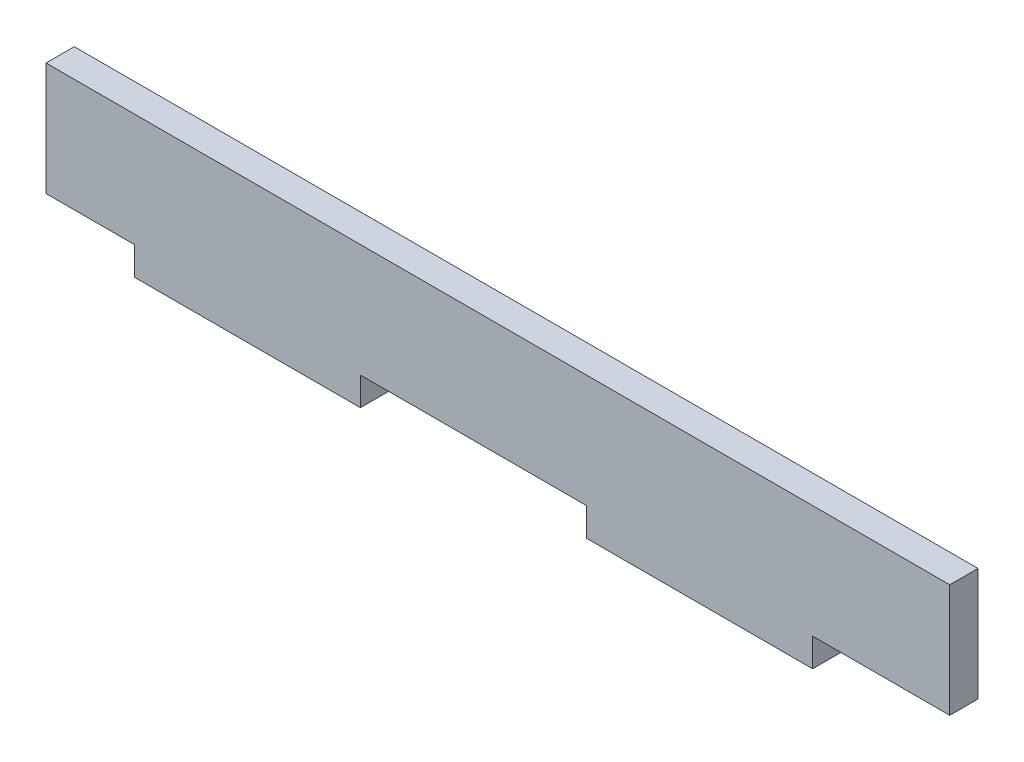
ISO-10303-21;
HEADER;
FILE_DESCRIPTION(('STEP AP214'),'2;1');
FILE_NAME('part.step','',(''),(''),'','','');
FILE_SCHEMA(('AUTOMOTIVE_DESIGN { 1 0 10303 214 1 1 1 1 }'));
ENDSEC;
DATA;
#1=APPLICATION_CONTEXT('core data for automotive mechanical design processes');
#2=APPLICATION_PROTOCOL_DEFINITION('international standard','automotive_design',2000,#1);
#3=PRODUCT_CONTEXT('',#1,'mechanical');
#4=PRODUCT('Part','Part','',(#3));
#5=PRODUCT_RELATED_PRODUCT_CATEGORY('part','',(#4));
#6=PRODUCT_DEFINITION_FORMATION('','',#4);
#7=PRODUCT_DEFINITION_CONTEXT('part definition',#1,'design');
#8=PRODUCT_DEFINITION('design','',#6,#7);
#9=PRODUCT_DEFINITION_SHAPE('','',#8);
#10=(LENGTH_UNIT() NAMED_UNIT(*) SI_UNIT(.MILLI.,.METRE.));
#11=(NAMED_UNIT(*) PLANE_ANGLE_UNIT() SI_UNIT($,.RADIAN.));
#12=(NAMED_UNIT(*) SI_UNIT($,.STERADIAN.) SOLID_ANGLE_UNIT());
#13=UNCERTAINTY_MEASURE_WITH_UNIT(LENGTH_MEASURE(1.E-05),#10,'distance_accuracy_value','');
#14=(GEOMETRIC_REPRESENTATION_CONTEXT(3) GLOBAL_UNCERTAINTY_ASSIGNED_CONTEXT((#13)) GLOBAL_UNIT_ASSIGNED_CONTEXT((#10,
#11,#12)) REPRESENTATION_CONTEXT('',''));
#15=CARTESIAN_POINT('',(0.,0.,0.));
#16=DIRECTION('',(0.,0.,1.));
#17=DIRECTION('',(1.,0.,0.));
#18=AXIS2_PLACEMENT_3D('',#15,#16,#17);
#19=CARTESIAN_POINT('',(30.9701938253052,18.6034392371989,6.35));
#20=DIRECTION('',(0.,1.,0.));
#21=DIRECTION('',(0.,0.,1.));
#22=AXIS2_PLACEMENT_3D('',#19,#20,#21);
#23=PLANE('',#22);
#24=DIRECTION('',(1.,0.,0.));
#25=VECTOR('',#24,1.);
#26=CARTESIAN_POINT('',(30.9701938253052,18.6034392371989,6.35));
#27=LINE('',#26,#25);
#28=CARTESIAN_POINT('',(50.8,18.6034392371989,6.35));
#29=VERTEX_POINT('',#28);
#30=CARTESIAN_POINT('',(101.6,18.6034392371989,6.35));
#31=VERTEX_POINT('',#30);
#32=EDGE_CURVE('E160',#29,#31,#27,.T.);
#33=ORIENTED_EDGE('',*,*,#32,.F.);
#34=DIRECTION('',(0.,0.,1.));
#35=VECTOR('',#34,1.);
#36=CARTESIAN_POINT('',(50.8,18.6034392371989,-0.00100000000000013));
#37=LINE('',#36,#35);
#38=CARTESIAN_POINT('',(50.8,18.6034392371989,0.));
#39=VERTEX_POINT('',#38);
#40=EDGE_CURVE('E212',#39,#29,#37,.T.);
#41=ORIENTED_EDGE('',*,*,#40,.F.);
#42=DIRECTION('',(1.,0.,0.));
#43=VECTOR('',#42,1.);
#44=CARTESIAN_POINT('',(30.9701938253052,18.6034392371989,0.));
#45=LINE('',#44,#43);
#46=CARTESIAN_POINT('',(101.6,18.6034392371989,0.));
#47=VERTEX_POINT('',#46);
#48=EDGE_CURVE('E147',#39,#47,#45,.T.);
#49=ORIENTED_EDGE('',*,*,#48,.T.);
#50=DIRECTION('',(0.,0.,1.));
#51=VECTOR('',#50,1.);
#52=CARTESIAN_POINT('',(101.6,18.6034392371989,-0.00100000000000013));
#53=LINE('',#52,#51);
#54=EDGE_CURVE('E189',#47,#31,#53,.T.);
#55=ORIENTED_EDGE('',*,*,#54,.T.);
#56=EDGE_LOOP('',(#33,#41,#49,#55));
#57=FACE_BOUND('',#56,.T.);
#58=ADVANCED_FACE('F33',(#57),#23,.F.);
#59=CARTESIAN_POINT('',(30.9701938253052,18.6034392371989,6.35));
#60=DIRECTION('',(1.,0.,0.));
#61=DIRECTION('',(0.,1.,0.));
#62=AXIS2_PLACEMENT_3D('',#59,#60,#61);
#63=PLANE('',#62);
#64=DIRECTION('',(0.,-1.,0.));
#65=VECTOR('',#64,1.);
#66=CARTESIAN_POINT('',(30.9701938253052,18.6034392371989,0.));
#67=LINE('',#66,#65);
#68=CARTESIAN_POINT('',(30.9701938253052,50.3534392371989,0.));
#69=VERTEX_POINT('',#68);
#70=CARTESIAN_POINT('',(30.9701938253052,24.9534392371989,0.));
#71=VERTEX_POINT('',#70);
#72=EDGE_CURVE('E132',#69,#71,#67,.T.);
#73=ORIENTED_EDGE('',*,*,#72,.T.);
#74=DIRECTION('',(0.,0.,1.));
#75=VECTOR('',#74,1.);
#76=CARTESIAN_POINT('',(30.9701938253052,24.9534392371989,-0.00100000000000013));
#77=LINE('',#76,#75);
#78=CARTESIAN_POINT('',(30.9701938253052,24.9534392371989,6.35));
#79=VERTEX_POINT('',#78);
#80=EDGE_CURVE('E121',#71,#79,#77,.T.);
#81=ORIENTED_EDGE('',*,*,#80,.T.);
#82=DIRECTION('',(0.,-1.,0.));
#83=VECTOR('',#82,1.);
#84=CARTESIAN_POINT('',(30.9701938253052,18.6034392371989,6.35));
#85=LINE('',#84,#83);
#86=CARTESIAN_POINT('',(30.9701938253052,50.3534392371989,6.35));
#87=VERTEX_POINT('',#86);
#88=EDGE_CURVE('E156',#87,#79,#85,.T.);
#89=ORIENTED_EDGE('',*,*,#88,.F.);
#90=DIRECTION('',(0.,0.,-1.));
#91=VECTOR('',#90,1.);
#92=CARTESIAN_POINT('',(30.9701938253052,50.3534392371989,6.35));
#93=LINE('',#92,#91);
#94=EDGE_CURVE('E41',#87,#69,#93,.T.);
#95=ORIENTED_EDGE('',*,*,#94,.T.);
#96=EDGE_LOOP('',(#73,#81,#89,#95));
#97=FACE_BOUND('',#96,.T.);
#98=ADVANCED_FACE('F35',(#97),#63,.F.);
#99=CARTESIAN_POINT('',(152.4,18.6034392371989,6.35));
#100=VERTEX_POINT('',#99);
#101=CARTESIAN_POINT('',(203.2,18.6034392371989,6.35));
#102=VERTEX_POINT('',#101);
#103=EDGE_CURVE('E165',#100,#102,#27,.T.);
#104=ORIENTED_EDGE('',*,*,#103,.F.);
#105=DIRECTION('',(0.,0.,1.));
#106=VECTOR('',#105,1.);
#107=CARTESIAN_POINT('',(152.4,18.6034392371989,-0.00100000000000013));
#108=LINE('',#107,#106);
#109=CARTESIAN_POINT('',(152.4,18.6034392371989,0.));
#110=VERTEX_POINT('',#109);
#111=EDGE_CURVE('E192',#110,#100,#108,.T.);
#112=ORIENTED_EDGE('',*,*,#111,.F.);
#113=CARTESIAN_POINT('',(203.2,18.6034392371989,0.));
#114=VERTEX_POINT('',#113);
#115=EDGE_CURVE('E144',#110,#114,#45,.T.);
#116=ORIENTED_EDGE('',*,*,#115,.T.);
#117=DIRECTION('',(0.,0.,1.));
#118=VECTOR('',#117,1.);
#119=CARTESIAN_POINT('',(203.2,18.6034392371989,-0.00100000000000013));
#120=LINE('',#119,#118);
#121=EDGE_CURVE('E170',#114,#102,#120,.T.);
#122=ORIENTED_EDGE('',*,*,#121,.T.);
#123=EDGE_LOOP('',(#104,#112,#116,#122));
#124=FACE_BOUND('',#123,.T.);
#125=ADVANCED_FACE('F237',(#124),#23,.F.);
#126=CARTESIAN_POINT('',(234.,18.6034392371989,6.35));
#127=DIRECTION('',(-1.,0.,0.));
#128=DIRECTION('',(0.,0.,1.));
#129=AXIS2_PLACEMENT_3D('',#126,#127,#128);
#130=PLANE('',#129);
#131=DIRECTION('',(0.,1.,0.));
#132=VECTOR('',#131,1.);
#133=CARTESIAN_POINT('',(234.,18.6034392371989,6.35));
#134=LINE('',#133,#132);
#135=CARTESIAN_POINT('',(234.,24.9534392371989,6.35));
#136=VERTEX_POINT('',#135);
#137=CARTESIAN_POINT('',(234.,50.3534392371989,6.35));
#138=VERTEX_POINT('',#137);
#139=EDGE_CURVE('E157',#136,#138,#134,.T.);
#140=ORIENTED_EDGE('',*,*,#139,.F.);
#141=DIRECTION('',(0.,0.,1.));
#142=VECTOR('',#141,1.);
#143=CARTESIAN_POINT('',(234.,24.9534392371989,-0.00100000000000013));
#144=LINE('',#143,#142);
#145=CARTESIAN_POINT('',(234.,24.9534392371989,0.));
#146=VERTEX_POINT('',#145);
#147=EDGE_CURVE('E173',#146,#136,#144,.T.);
#148=ORIENTED_EDGE('',*,*,#147,.F.);
#149=DIRECTION('',(0.,1.,0.));
#150=VECTOR('',#149,1.);
#151=CARTESIAN_POINT('',(234.,18.6034392371989,0.));
#152=LINE('',#151,#150);
#153=CARTESIAN_POINT('',(234.,50.3534392371989,0.));
#154=VERTEX_POINT('',#153);
#155=EDGE_CURVE('E153',#146,#154,#152,.T.);
#156=ORIENTED_EDGE('',*,*,#155,.T.);
#157=DIRECTION('',(0.,0.,-1.));
#158=VECTOR('',#157,1.);
#159=CARTESIAN_POINT('',(234.,50.3534392371989,6.35));
#160=LINE('',#159,#158);
#161=EDGE_CURVE('E11',#138,#154,#160,.T.);
#162=ORIENTED_EDGE('',*,*,#161,.F.);
#163=EDGE_LOOP('',(#140,#148,#156,#162));
#164=FACE_BOUND('',#163,.T.);
#165=ADVANCED_FACE('F231',(#164),#130,.F.);
#166=CARTESIAN_POINT('',(30.9701938253052,50.3534392371989,6.35));
#167=DIRECTION('',(0.,-1.,0.));
#168=DIRECTION('',(0.,0.,-1.));
#169=AXIS2_PLACEMENT_3D('',#166,#167,#168);
#170=PLANE('',#169);
#171=DIRECTION('',(-1.,0.,0.));
#172=VECTOR('',#171,1.);
#173=CARTESIAN_POINT('',(30.9701938253052,50.3534392371989,0.));
#174=LINE('',#173,#172);
#175=EDGE_CURVE('E155',#154,#69,#174,.T.);
#176=ORIENTED_EDGE('',*,*,#175,.T.);
#177=ORIENTED_EDGE('',*,*,#94,.F.);
#178=DIRECTION('',(-1.,0.,0.));
#179=VECTOR('',#178,1.);
#180=CARTESIAN_POINT('',(30.9701938253052,50.3534392371989,6.35));
#181=LINE('',#180,#179);
#182=EDGE_CURVE('E150',#138,#87,#181,.T.);
#183=ORIENTED_EDGE('',*,*,#182,.F.);
#184=ORIENTED_EDGE('',*,*,#161,.T.);
#185=EDGE_LOOP('',(#176,#177,#183,#184));
#186=FACE_BOUND('',#185,.T.);
#187=ADVANCED_FACE('F223',(#186),#170,.F.);
#188=CARTESIAN_POINT('',(0.,0.,6.35));
#189=DIRECTION('',(0.,0.,-1.));
#190=DIRECTION('',(-1.,0.,0.));
#191=AXIS2_PLACEMENT_3D('',#188,#189,#190);
#192=PLANE('',#191);
#193=ORIENTED_EDGE('',*,*,#88,.T.);
#194=DIRECTION('',(-1.,0.,0.));
#195=VECTOR('',#194,1.);
#196=CARTESIAN_POINT('',(30.9701938253052,24.9534392371989,6.35));
#197=LINE('',#196,#195);
#198=CARTESIAN_POINT('',(50.8,24.9534392371989,6.35));
#199=VERTEX_POINT('',#198);
#200=EDGE_CURVE('E127',#199,#79,#197,.T.);
#201=ORIENTED_EDGE('',*,*,#200,.F.);
#202=DIRECTION('',(0.,1.,0.));
#203=VECTOR('',#202,1.);
#204=CARTESIAN_POINT('',(50.8,18.6034392371989,6.35));
#205=LINE('',#204,#203);
#206=EDGE_CURVE('E140',#29,#199,#205,.T.);
#207=ORIENTED_EDGE('',*,*,#206,.F.);
#208=ORIENTED_EDGE('',*,*,#32,.T.);
#209=DIRECTION('',(0.,-1.,0.));
#210=VECTOR('',#209,1.);
#211=CARTESIAN_POINT('',(101.6,18.6034392371989,6.35));
#212=LINE('',#211,#210);
#213=CARTESIAN_POINT('',(101.6,24.9534392371989,6.35));
#214=VERTEX_POINT('',#213);
#215=EDGE_CURVE('E202',#214,#31,#212,.T.);
#216=ORIENTED_EDGE('',*,*,#215,.F.);
#217=DIRECTION('',(-1.,0.,0.));
#218=VECTOR('',#217,1.);
#219=CARTESIAN_POINT('',(101.6,24.9534392371989,6.35));
#220=LINE('',#219,#218);
#221=CARTESIAN_POINT('',(152.4,24.9534392371989,6.35));
#222=VERTEX_POINT('',#221);
#223=EDGE_CURVE('E193',#222,#214,#220,.T.);
#224=ORIENTED_EDGE('',*,*,#223,.F.);
#225=DIRECTION('',(0.,1.,0.));
#226=VECTOR('',#225,1.);
#227=CARTESIAN_POINT('',(152.4,18.6034392371989,6.35));
#228=LINE('',#227,#226);
#229=EDGE_CURVE('E200',#100,#222,#228,.T.);
#230=ORIENTED_EDGE('',*,*,#229,.F.);
#231=ORIENTED_EDGE('',*,*,#103,.T.);
#232=DIRECTION('',(0.,-1.,0.));
#233=VECTOR('',#232,1.);
#234=CARTESIAN_POINT('',(203.2,18.6034392371989,6.35));
#235=LINE('',#234,#233);
#236=CARTESIAN_POINT('',(203.2,24.9534392371989,6.35));
#237=VERTEX_POINT('',#236);
#238=EDGE_CURVE('E181',#237,#102,#235,.T.);
#239=ORIENTED_EDGE('',*,*,#238,.F.);
#240=DIRECTION('',(-1.,0.,0.));
#241=VECTOR('',#240,1.);
#242=CARTESIAN_POINT('',(203.2,24.9534392371989,6.35));
#243=LINE('',#242,#241);
#244=EDGE_CURVE('E174',#136,#237,#243,.T.);
#245=ORIENTED_EDGE('',*,*,#244,.F.);
#246=ORIENTED_EDGE('',*,*,#139,.T.);
#247=ORIENTED_EDGE('',*,*,#182,.T.);
#248=EDGE_LOOP('',(#193,#201,#207,#208,#216,#224,#230,#231,#239,#245,#246,#247));
#249=FACE_BOUND('',#248,.T.);
#250=ADVANCED_FACE('F221',(#249),#192,.F.);
#251=CARTESIAN_POINT('',(0.,0.,0.));
#252=DIRECTION('',(0.,0.,-1.));
#253=DIRECTION('',(-1.,0.,0.));
#254=AXIS2_PLACEMENT_3D('',#251,#252,#253);
#255=PLANE('',#254);
#256=DIRECTION('',(-1.,0.,0.));
#257=VECTOR('',#256,1.);
#258=CARTESIAN_POINT('',(30.9701938253052,24.9534392371989,0.));
#259=LINE('',#258,#257);
#260=CARTESIAN_POINT('',(50.8,24.9534392371989,0.));
#261=VERTEX_POINT('',#260);
#262=EDGE_CURVE('E124',#261,#71,#259,.T.);
#263=ORIENTED_EDGE('',*,*,#262,.T.);
#264=ORIENTED_EDGE('',*,*,#72,.F.);
#265=ORIENTED_EDGE('',*,*,#175,.F.);
#266=ORIENTED_EDGE('',*,*,#155,.F.);
#267=DIRECTION('',(-1.,0.,0.));
#268=VECTOR('',#267,1.);
#269=CARTESIAN_POINT('',(203.2,24.9534392371989,0.));
#270=LINE('',#269,#268);
#271=CARTESIAN_POINT('',(203.2,24.9534392371989,0.));
#272=VERTEX_POINT('',#271);
#273=EDGE_CURVE('E186',#146,#272,#270,.T.);
#274=ORIENTED_EDGE('',*,*,#273,.T.);
#275=DIRECTION('',(0.,-1.,0.));
#276=VECTOR('',#275,1.);
#277=CARTESIAN_POINT('',(203.2,18.6034392371989,0.));
#278=LINE('',#277,#276);
#279=EDGE_CURVE('E183',#272,#114,#278,.T.);
#280=ORIENTED_EDGE('',*,*,#279,.T.);
#281=ORIENTED_EDGE('',*,*,#115,.F.);
#282=DIRECTION('',(0.,1.,0.));
#283=VECTOR('',#282,1.);
#284=CARTESIAN_POINT('',(152.4,18.6034392371989,0.));
#285=LINE('',#284,#283);
#286=CARTESIAN_POINT('',(152.4,24.9534392371989,0.));
#287=VERTEX_POINT('',#286);
#288=EDGE_CURVE('E178',#110,#287,#285,.T.);
#289=ORIENTED_EDGE('',*,*,#288,.T.);
#290=DIRECTION('',(-1.,0.,0.));
#291=VECTOR('',#290,1.);
#292=CARTESIAN_POINT('',(101.6,24.9534392371989,0.));
#293=LINE('',#292,#291);
#294=CARTESIAN_POINT('',(101.6,24.9534392371989,0.));
#295=VERTEX_POINT('',#294);
#296=EDGE_CURVE('E207',#287,#295,#293,.T.);
#297=ORIENTED_EDGE('',*,*,#296,.T.);
#298=DIRECTION('',(0.,-1.,0.));
#299=VECTOR('',#298,1.);
#300=CARTESIAN_POINT('',(101.6,18.6034392371989,0.));
#301=LINE('',#300,#299);
#302=EDGE_CURVE('E204',#295,#47,#301,.T.);
#303=ORIENTED_EDGE('',*,*,#302,.T.);
#304=ORIENTED_EDGE('',*,*,#48,.F.);
#305=DIRECTION('',(0.,1.,0.));
#306=VECTOR('',#305,1.);
#307=CARTESIAN_POINT('',(50.8,18.6034392371989,0.));
#308=LINE('',#307,#306);
#309=EDGE_CURVE('E139',#39,#261,#308,.T.);
#310=ORIENTED_EDGE('',*,*,#309,.T.);
#311=EDGE_LOOP('',(#263,#264,#265,#266,#274,#280,#281,#289,#297,#303,#304,#310));
#312=FACE_BOUND('',#311,.T.);
#313=ADVANCED_FACE('F136',(#312),#255,.T.);
#314=CARTESIAN_POINT('',(203.2,18.6034392371989,-0.00100000000000013));
#315=DIRECTION('',(-1.,0.,0.));
#316=DIRECTION('',(0.,0.,1.));
#317=AXIS2_PLACEMENT_3D('',#314,#315,#316);
#318=PLANE('',#317);
#319=DIRECTION('',(0.,0.,1.));
#320=VECTOR('',#319,1.);
#321=CARTESIAN_POINT('',(203.2,24.9534392371989,-0.00100000000000013));
#322=LINE('',#321,#320);
#323=EDGE_CURVE('E176',#272,#237,#322,.T.);
#324=ORIENTED_EDGE('',*,*,#323,.T.);
#325=ORIENTED_EDGE('',*,*,#238,.T.);
#326=ORIENTED_EDGE('',*,*,#121,.F.);
#327=ORIENTED_EDGE('',*,*,#279,.F.);
#328=EDGE_LOOP('',(#324,#325,#326,#327));
#329=FACE_BOUND('',#328,.T.);
#330=ADVANCED_FACE('F229',(#329),#318,.F.);
#331=CARTESIAN_POINT('',(203.2,24.9534392371989,-0.00100000000000013));
#332=DIRECTION('',(0.,1.,0.));
#333=DIRECTION('',(0.,0.,1.));
#334=AXIS2_PLACEMENT_3D('',#331,#332,#333);
#335=PLANE('',#334);
#336=ORIENTED_EDGE('',*,*,#147,.T.);
#337=ORIENTED_EDGE('',*,*,#244,.T.);
#338=ORIENTED_EDGE('',*,*,#323,.F.);
#339=ORIENTED_EDGE('',*,*,#273,.F.);
#340=EDGE_LOOP('',(#336,#337,#338,#339));
#341=FACE_BOUND('',#340,.T.);
#342=ADVANCED_FACE('F260',(#341),#335,.F.);
#343=CARTESIAN_POINT('',(101.6,18.6034392371989,-0.00100000000000013));
#344=DIRECTION('',(-1.,0.,0.));
#345=DIRECTION('',(0.,0.,1.));
#346=AXIS2_PLACEMENT_3D('',#343,#344,#345);
#347=PLANE('',#346);
#348=DIRECTION('',(0.,0.,1.));
#349=VECTOR('',#348,1.);
#350=CARTESIAN_POINT('',(101.6,24.9534392371989,-0.00100000000000013));
#351=LINE('',#350,#349);
#352=EDGE_CURVE('E196',#295,#214,#351,.T.);
#353=ORIENTED_EDGE('',*,*,#352,.T.);
#354=ORIENTED_EDGE('',*,*,#215,.T.);
#355=ORIENTED_EDGE('',*,*,#54,.F.);
#356=ORIENTED_EDGE('',*,*,#302,.F.);
#357=EDGE_LOOP('',(#353,#354,#355,#356));
#358=FACE_BOUND('',#357,.T.);
#359=ADVANCED_FACE('F263',(#358),#347,.F.);
#360=CARTESIAN_POINT('',(101.6,24.9534392371989,-0.00100000000000013));
#361=DIRECTION('',(0.,1.,0.));
#362=DIRECTION('',(0.,0.,1.));
#363=AXIS2_PLACEMENT_3D('',#360,#361,#362);
#364=PLANE('',#363);
#365=DIRECTION('',(0.,0.,1.));
#366=VECTOR('',#365,1.);
#367=CARTESIAN_POINT('',(152.4,24.9534392371989,-0.00100000000000013));
#368=LINE('',#367,#366);
#369=EDGE_CURVE('E56',#287,#222,#368,.T.);
#370=ORIENTED_EDGE('',*,*,#369,.T.);
#371=ORIENTED_EDGE('',*,*,#223,.T.);
#372=ORIENTED_EDGE('',*,*,#352,.F.);
#373=ORIENTED_EDGE('',*,*,#296,.F.);
#374=EDGE_LOOP('',(#370,#371,#372,#373));
#375=FACE_BOUND('',#374,.T.);
#376=ADVANCED_FACE('F269',(#375),#364,.F.);
#377=CARTESIAN_POINT('',(152.4,18.6034392371989,-0.00100000000000013));
#378=DIRECTION('',(1.,0.,0.));
#379=DIRECTION('',(0.,0.,-1.));
#380=AXIS2_PLACEMENT_3D('',#377,#378,#379);
#381=PLANE('',#380);
#382=ORIENTED_EDGE('',*,*,#111,.T.);
#383=ORIENTED_EDGE('',*,*,#229,.T.);
#384=ORIENTED_EDGE('',*,*,#369,.F.);
#385=ORIENTED_EDGE('',*,*,#288,.F.);
#386=EDGE_LOOP('',(#382,#383,#384,#385));
#387=FACE_BOUND('',#386,.T.);
#388=ADVANCED_FACE('F255',(#387),#381,.F.);
#389=CARTESIAN_POINT('',(30.9701938253052,24.9534392371989,-0.00100000000000013));
#390=DIRECTION('',(0.,1.,0.));
#391=DIRECTION('',(0.,0.,1.));
#392=AXIS2_PLACEMENT_3D('',#389,#390,#391);
#393=PLANE('',#392);
#394=DIRECTION('',(0.,0.,1.));
#395=VECTOR('',#394,1.);
#396=CARTESIAN_POINT('',(50.8,24.9534392371989,-0.00100000000000013));
#397=LINE('',#396,#395);
#398=EDGE_CURVE('E48',#261,#199,#397,.T.);
#399=ORIENTED_EDGE('',*,*,#398,.T.);
#400=ORIENTED_EDGE('',*,*,#200,.T.);
#401=ORIENTED_EDGE('',*,*,#80,.F.);
#402=ORIENTED_EDGE('',*,*,#262,.F.);
#403=EDGE_LOOP('',(#399,#400,#401,#402));
#404=FACE_BOUND('',#403,.T.);
#405=ADVANCED_FACE('F123',(#404),#393,.F.);
#406=CARTESIAN_POINT('',(50.8,18.6034392371989,-0.00100000000000013));
#407=DIRECTION('',(1.,0.,0.));
#408=DIRECTION('',(0.,0.,-1.));
#409=AXIS2_PLACEMENT_3D('',#406,#407,#408);
#410=PLANE('',#409);
#411=ORIENTED_EDGE('',*,*,#40,.T.);
#412=ORIENTED_EDGE('',*,*,#206,.T.);
#413=ORIENTED_EDGE('',*,*,#398,.F.);
#414=ORIENTED_EDGE('',*,*,#309,.F.);
#415=EDGE_LOOP('',(#411,#412,#413,#414));
#416=FACE_BOUND('',#415,.T.);
#417=ADVANCED_FACE('F218',(#416),#410,.F.);
#418=CLOSED_SHELL('',(#58,#98,#125,#165,#187,#250,#313,#330,#342,#359,#376,#388,#405,#417));
#419=MANIFOLD_SOLID_BREP('B2',#418);
#420=ADVANCED_BREP_SHAPE_REPRESENTATION('',(#18,#419),#14);
#421=SHAPE_DEFINITION_REPRESENTATION(#9,#420);
ENDSEC;
END-ISO-10303-21;
